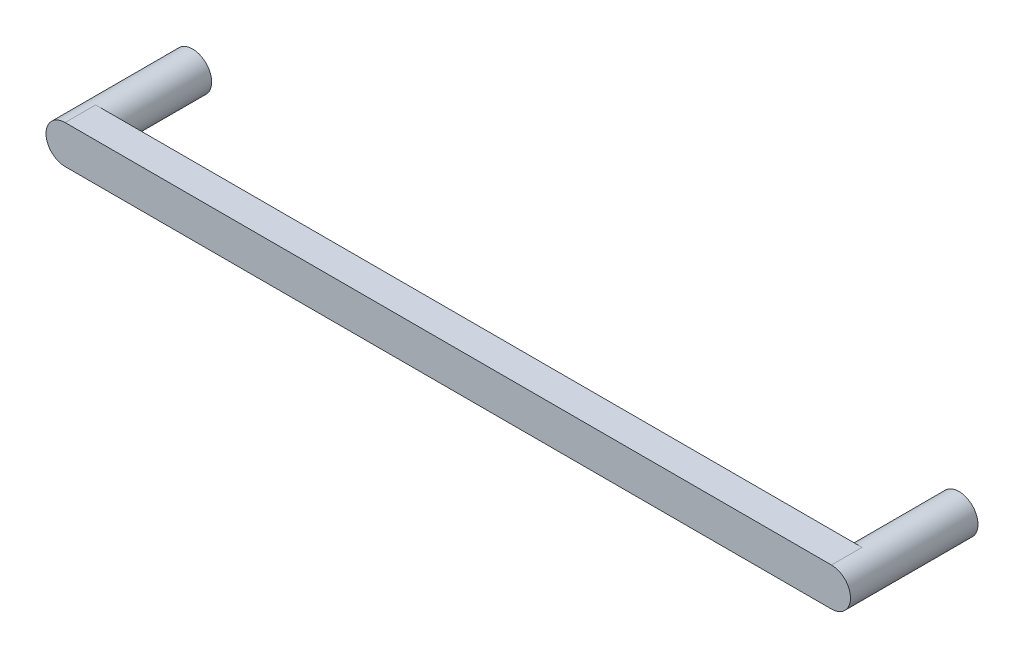
ISO-10303-21;
HEADER;
FILE_DESCRIPTION(('STEP AP214'),'2;1');
FILE_NAME('part.step','',(''),(''),'','','');
FILE_SCHEMA(('AUTOMOTIVE_DESIGN { 1 0 10303 214 1 1 1 1 }'));
ENDSEC;
DATA;
#1=APPLICATION_CONTEXT('core data for automotive mechanical design processes');
#2=APPLICATION_PROTOCOL_DEFINITION('international standard','automotive_design',2000,#1);
#3=PRODUCT_CONTEXT('',#1,'mechanical');
#4=PRODUCT('Part','Part','',(#3));
#5=PRODUCT_RELATED_PRODUCT_CATEGORY('part','',(#4));
#6=PRODUCT_DEFINITION_FORMATION('','',#4);
#7=PRODUCT_DEFINITION_CONTEXT('part definition',#1,'design');
#8=PRODUCT_DEFINITION('design','',#6,#7);
#9=PRODUCT_DEFINITION_SHAPE('','',#8);
#10=(LENGTH_UNIT() NAMED_UNIT(*) SI_UNIT(.MILLI.,.METRE.));
#11=(NAMED_UNIT(*) PLANE_ANGLE_UNIT() SI_UNIT($,.RADIAN.));
#12=(NAMED_UNIT(*) SI_UNIT($,.STERADIAN.) SOLID_ANGLE_UNIT());
#13=UNCERTAINTY_MEASURE_WITH_UNIT(LENGTH_MEASURE(1.E-05),#10,'distance_accuracy_value','');
#14=(GEOMETRIC_REPRESENTATION_CONTEXT(3) GLOBAL_UNCERTAINTY_ASSIGNED_CONTEXT((#13)) GLOBAL_UNIT_ASSIGNED_CONTEXT((#10,
#11,#12)) REPRESENTATION_CONTEXT('',''));
#15=CARTESIAN_POINT('',(0.,0.,0.));
#16=DIRECTION('',(0.,0.,1.));
#17=DIRECTION('',(1.,0.,0.));
#18=AXIS2_PLACEMENT_3D('',#15,#16,#17);
#19=CARTESIAN_POINT('',(0.,0.,0.));
#20=DIRECTION('',(0.,0.,1.));
#21=DIRECTION('',(1.,0.,0.));
#22=AXIS2_PLACEMENT_3D('',#19,#20,#21);
#23=PLANE('',#22);
#24=DIRECTION('',(-1.,0.,0.));
#25=VECTOR('',#24,1.);
#26=CARTESIAN_POINT('',(0.,0.,0.));
#27=LINE('',#26,#25);
#28=CARTESIAN_POINT('',(-2.5,0.,0.));
#29=VERTEX_POINT('',#28);
#30=CARTESIAN_POINT('',(-102.9,0.,0.));
#31=VERTEX_POINT('',#30);
#32=EDGE_CURVE('E123',#29,#31,#27,.T.);
#33=ORIENTED_EDGE('',*,*,#32,.T.);
#34=CARTESIAN_POINT('',(-102.9,2.5,0.));
#35=DIRECTION('',(0.,0.,1.));
#36=DIRECTION('',(1.,0.,0.));
#37=AXIS2_PLACEMENT_3D('',#34,#35,#36);
#38=CIRCLE('',#37,2.50000000000001);
#39=CARTESIAN_POINT('',(-102.9,5.00000000000001,0.));
#40=VERTEX_POINT('',#39);
#41=EDGE_CURVE('E83',#31,#40,#38,.T.);
#42=ORIENTED_EDGE('',*,*,#41,.T.);
#43=DIRECTION('',(-1.,0.,0.));
#44=VECTOR('',#43,1.);
#45=CARTESIAN_POINT('',(0.,5.,0.));
#46=LINE('',#45,#44);
#47=CARTESIAN_POINT('',(-2.5,5.,0.));
#48=VERTEX_POINT('',#47);
#49=EDGE_CURVE('E120',#48,#40,#46,.T.);
#50=ORIENTED_EDGE('',*,*,#49,.F.);
#51=CARTESIAN_POINT('',(-2.5,2.5,0.));
#52=DIRECTION('',(0.,0.,1.));
#53=DIRECTION('',(1.,0.,0.));
#54=AXIS2_PLACEMENT_3D('',#51,#52,#53);
#55=CIRCLE('',#54,2.5);
#56=EDGE_CURVE('E92',#48,#29,#55,.T.);
#57=ORIENTED_EDGE('',*,*,#56,.T.);
#58=EDGE_LOOP('',(#33,#42,#50,#57));
#59=FACE_BOUND('',#58,.T.);
#60=ADVANCED_FACE('F54',(#59),#23,.F.);
#61=CARTESIAN_POINT('',(-2.5,2.5,4.));
#62=DIRECTION('',(0.,0.,-1.));
#63=DIRECTION('',(-1.,0.,0.));
#64=AXIS2_PLACEMENT_3D('',#61,#62,#63);
#65=CYLINDRICAL_SURFACE('',#64,2.5);
#66=DIRECTION('',(0.,0.,-1.));
#67=VECTOR('',#66,1.);
#68=CARTESIAN_POINT('',(-2.5,0.,4.));
#69=LINE('',#68,#67);
#70=CARTESIAN_POINT('',(-2.5,0.,4.));
#71=VERTEX_POINT('',#70);
#72=EDGE_CURVE('E113',#71,#29,#69,.T.);
#73=ORIENTED_EDGE('',*,*,#72,.T.);
#74=ORIENTED_EDGE('',*,*,#56,.F.);
#75=DIRECTION('',(0.,0.,-1.));
#76=VECTOR('',#75,1.);
#77=CARTESIAN_POINT('',(-2.5,5.,4.));
#78=LINE('',#77,#76);
#79=CARTESIAN_POINT('',(-2.5,5.,4.));
#80=VERTEX_POINT('',#79);
#81=EDGE_CURVE('E71',#80,#48,#78,.T.);
#82=ORIENTED_EDGE('',*,*,#81,.F.);
#83=CARTESIAN_POINT('',(-2.5,2.5,4.));
#84=DIRECTION('',(0.,0.,1.));
#85=DIRECTION('',(1.,0.,0.));
#86=AXIS2_PLACEMENT_3D('',#83,#84,#85);
#87=CIRCLE('',#86,2.5);
#88=EDGE_CURVE('E115',#71,#80,#87,.T.);
#89=ORIENTED_EDGE('',*,*,#88,.F.);
#90=EDGE_LOOP('',(#73,#74,#82,#89));
#91=FACE_BOUND('',#90,.T.);
#92=CARTESIAN_POINT('',(-2.5,2.5,-12.7));
#93=DIRECTION('',(0.,0.,1.));
#94=DIRECTION('',(1.,0.,0.));
#95=AXIS2_PLACEMENT_3D('',#92,#93,#94);
#96=CIRCLE('',#95,2.5);
#97=CARTESIAN_POINT('',(0.,2.5,-12.7));
#98=VERTEX_POINT('',#97);
#99=EDGE_CURVE('E124',#98,#98,#96,.T.);
#100=ORIENTED_EDGE('',*,*,#99,.T.);
#101=EDGE_LOOP('',(#100));
#102=FACE_BOUND('',#101,.T.);
#103=ADVANCED_FACE('F127',(#91,#102),#65,.T.);
#104=CARTESIAN_POINT('',(0.,0.,4.));
#105=DIRECTION('',(0.,0.,1.));
#106=DIRECTION('',(1.,0.,0.));
#107=AXIS2_PLACEMENT_3D('',#104,#105,#106);
#108=PLANE('',#107);
#109=ORIENTED_EDGE('',*,*,#88,.T.);
#110=DIRECTION('',(-1.,0.,0.));
#111=VECTOR('',#110,1.);
#112=CARTESIAN_POINT('',(0.,5.,4.));
#113=LINE('',#112,#111);
#114=CARTESIAN_POINT('',(-102.9,5.00000000000001,4.));
#115=VERTEX_POINT('',#114);
#116=EDGE_CURVE('E106',#80,#115,#113,.T.);
#117=ORIENTED_EDGE('',*,*,#116,.T.);
#118=CARTESIAN_POINT('',(-102.9,2.5,4.));
#119=DIRECTION('',(0.,0.,1.));
#120=DIRECTION('',(1.,0.,0.));
#121=AXIS2_PLACEMENT_3D('',#118,#119,#120);
#122=CIRCLE('',#121,2.50000000000001);
#123=CARTESIAN_POINT('',(-102.9,0.,4.));
#124=VERTEX_POINT('',#123);
#125=EDGE_CURVE('E101',#115,#124,#122,.T.);
#126=ORIENTED_EDGE('',*,*,#125,.T.);
#127=DIRECTION('',(-1.,0.,0.));
#128=VECTOR('',#127,1.);
#129=CARTESIAN_POINT('',(0.,0.,4.));
#130=LINE('',#129,#128);
#131=EDGE_CURVE('E104',#71,#124,#130,.T.);
#132=ORIENTED_EDGE('',*,*,#131,.F.);
#133=EDGE_LOOP('',(#109,#117,#126,#132));
#134=FACE_BOUND('',#133,.T.);
#135=ADVANCED_FACE('F102',(#134),#108,.T.);
#136=CARTESIAN_POINT('',(0.,5.,4.));
#137=DIRECTION('',(0.,-1.,0.));
#138=DIRECTION('',(1.,0.,0.));
#139=AXIS2_PLACEMENT_3D('',#136,#137,#138);
#140=PLANE('',#139);
#141=ORIENTED_EDGE('',*,*,#49,.T.);
#142=DIRECTION('',(0.,0.,-1.));
#143=VECTOR('',#142,1.);
#144=CARTESIAN_POINT('',(-102.9,5.00000000000001,4.));
#145=LINE('',#144,#143);
#146=EDGE_CURVE('E12',#115,#40,#145,.T.);
#147=ORIENTED_EDGE('',*,*,#146,.F.);
#148=ORIENTED_EDGE('',*,*,#116,.F.);
#149=ORIENTED_EDGE('',*,*,#81,.T.);
#150=EDGE_LOOP('',(#141,#147,#148,#149));
#151=FACE_BOUND('',#150,.T.);
#152=ADVANCED_FACE('F56',(#151),#140,.F.);
#153=CARTESIAN_POINT('',(-102.9,2.5,4.));
#154=DIRECTION('',(0.,0.,-1.));
#155=DIRECTION('',(-1.,0.,0.));
#156=AXIS2_PLACEMENT_3D('',#153,#154,#155);
#157=CYLINDRICAL_SURFACE('',#156,2.50000000000001);
#158=ORIENTED_EDGE('',*,*,#146,.T.);
#159=ORIENTED_EDGE('',*,*,#41,.F.);
#160=DIRECTION('',(0.,0.,-1.));
#161=VECTOR('',#160,1.);
#162=CARTESIAN_POINT('',(-102.9,0.,4.));
#163=LINE('',#162,#161);
#164=EDGE_CURVE('E63',#124,#31,#163,.T.);
#165=ORIENTED_EDGE('',*,*,#164,.F.);
#166=ORIENTED_EDGE('',*,*,#125,.F.);
#167=EDGE_LOOP('',(#158,#159,#165,#166));
#168=FACE_BOUND('',#167,.T.);
#169=CARTESIAN_POINT('',(-102.9,2.5,-12.7));
#170=DIRECTION('',(0.,0.,1.));
#171=DIRECTION('',(1.,0.,0.));
#172=AXIS2_PLACEMENT_3D('',#169,#170,#171);
#173=CIRCLE('',#172,2.50000000000001);
#174=CARTESIAN_POINT('',(-100.4,2.5,-12.7));
#175=VERTEX_POINT('',#174);
#176=EDGE_CURVE('E129',#175,#175,#173,.T.);
#177=ORIENTED_EDGE('',*,*,#176,.T.);
#178=EDGE_LOOP('',(#177));
#179=FACE_BOUND('',#178,.T.);
#180=ADVANCED_FACE('F109',(#168,#179),#157,.T.);
#181=CARTESIAN_POINT('',(0.,0.,4.));
#182=DIRECTION('',(0.,-1.,0.));
#183=DIRECTION('',(1.,0.,0.));
#184=AXIS2_PLACEMENT_3D('',#181,#182,#183);
#185=PLANE('',#184);
#186=ORIENTED_EDGE('',*,*,#32,.F.);
#187=ORIENTED_EDGE('',*,*,#72,.F.);
#188=ORIENTED_EDGE('',*,*,#131,.T.);
#189=ORIENTED_EDGE('',*,*,#164,.T.);
#190=EDGE_LOOP('',(#186,#187,#188,#189));
#191=FACE_BOUND('',#190,.T.);
#192=ADVANCED_FACE('F114',(#191),#185,.T.);
#193=CARTESIAN_POINT('',(-2.5,2.5,-12.7));
#194=DIRECTION('',(0.,0.,1.));
#195=DIRECTION('',(1.,0.,0.));
#196=AXIS2_PLACEMENT_3D('',#193,#194,#195);
#197=PLANE('',#196);
#198=ORIENTED_EDGE('',*,*,#99,.F.);
#199=EDGE_LOOP('',(#198));
#200=FACE_BOUND('',#199,.T.);
#201=ADVANCED_FACE('F141',(#200),#197,.F.);
#202=CARTESIAN_POINT('',(-102.9,2.5,-12.7));
#203=DIRECTION('',(0.,0.,1.));
#204=DIRECTION('',(1.,0.,0.));
#205=AXIS2_PLACEMENT_3D('',#202,#203,#204);
#206=PLANE('',#205);
#207=ORIENTED_EDGE('',*,*,#176,.F.);
#208=EDGE_LOOP('',(#207));
#209=FACE_BOUND('',#208,.T.);
#210=ADVANCED_FACE('F139',(#209),#206,.F.);
#211=CLOSED_SHELL('',(#60,#103,#135,#152,#180,#192,#201,#210));
#212=MANIFOLD_SOLID_BREP('B2',#211);
#213=ADVANCED_BREP_SHAPE_REPRESENTATION('',(#18,#212),#14);
#214=SHAPE_DEFINITION_REPRESENTATION(#9,#213);
ENDSEC;
END-ISO-10303-21;
